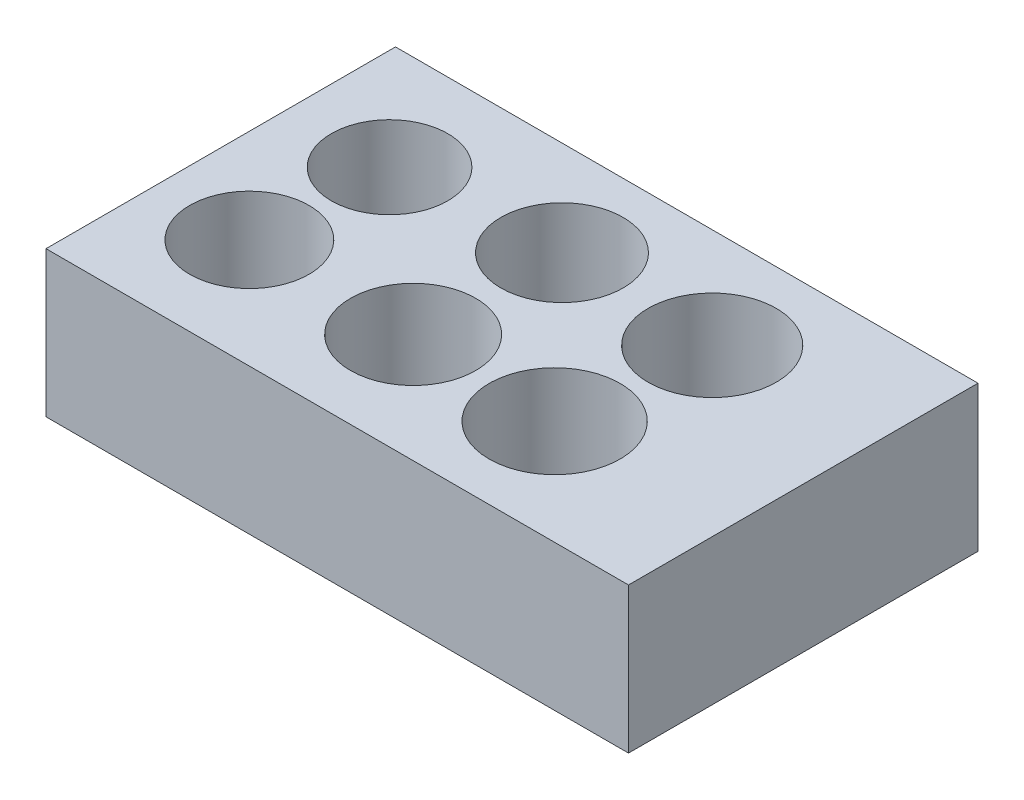
ISO-10303-21;
HEADER;
FILE_DESCRIPTION(('STEP AP214'),'2;1');
FILE_NAME('part.step','',(''),(''),'','','');
FILE_SCHEMA(('AUTOMOTIVE_DESIGN { 1 0 10303 214 1 1 1 1 }'));
ENDSEC;
DATA;
#1=APPLICATION_CONTEXT('core data for automotive mechanical design processes');
#2=APPLICATION_PROTOCOL_DEFINITION('international standard','automotive_design',2000,#1);
#3=PRODUCT_CONTEXT('',#1,'mechanical');
#4=PRODUCT('Part','Part','',(#3));
#5=PRODUCT_RELATED_PRODUCT_CATEGORY('part','',(#4));
#6=PRODUCT_DEFINITION_FORMATION('','',#4);
#7=PRODUCT_DEFINITION_CONTEXT('part definition',#1,'design');
#8=PRODUCT_DEFINITION('design','',#6,#7);
#9=PRODUCT_DEFINITION_SHAPE('','',#8);
#10=(LENGTH_UNIT() NAMED_UNIT(*) SI_UNIT(.MILLI.,.METRE.));
#11=(NAMED_UNIT(*) PLANE_ANGLE_UNIT() SI_UNIT($,.RADIAN.));
#12=(NAMED_UNIT(*) SI_UNIT($,.STERADIAN.) SOLID_ANGLE_UNIT());
#13=UNCERTAINTY_MEASURE_WITH_UNIT(LENGTH_MEASURE(1.E-05),#10,'distance_accuracy_value','');
#14=(GEOMETRIC_REPRESENTATION_CONTEXT(3) GLOBAL_UNCERTAINTY_ASSIGNED_CONTEXT((#13)) GLOBAL_UNIT_ASSIGNED_CONTEXT((#10,
#11,#12)) REPRESENTATION_CONTEXT('',''));
#15=CARTESIAN_POINT('',(0.,0.,0.));
#16=DIRECTION('',(0.,0.,1.));
#17=DIRECTION('',(1.,0.,0.));
#18=AXIS2_PLACEMENT_3D('',#15,#16,#17);
#19=CARTESIAN_POINT('',(0.,5.,0.));
#20=DIRECTION('',(1.,0.,0.));
#21=DIRECTION('',(0.,0.,-1.));
#22=AXIS2_PLACEMENT_3D('',#19,#20,#21);
#23=PLANE('',#22);
#24=DIRECTION('',(0.,0.,1.));
#25=VECTOR('',#24,1.);
#26=CARTESIAN_POINT('',(0.,0.,0.));
#27=LINE('',#26,#25);
#28=CARTESIAN_POINT('',(0.,0.,0.));
#29=VERTEX_POINT('',#28);
#30=CARTESIAN_POINT('',(0.,0.,12.));
#31=VERTEX_POINT('',#30);
#32=EDGE_CURVE('E98',#29,#31,#27,.T.);
#33=ORIENTED_EDGE('',*,*,#32,.T.);
#34=DIRECTION('',(0.,-1.,0.));
#35=VECTOR('',#34,1.);
#36=CARTESIAN_POINT('',(0.,5.,12.));
#37=LINE('',#36,#35);
#38=CARTESIAN_POINT('',(0.,5.,12.));
#39=VERTEX_POINT('',#38);
#40=EDGE_CURVE('E11',#39,#31,#37,.T.);
#41=ORIENTED_EDGE('',*,*,#40,.F.);
#42=DIRECTION('',(0.,0.,1.));
#43=VECTOR('',#42,1.);
#44=CARTESIAN_POINT('',(0.,5.,0.));
#45=LINE('',#44,#43);
#46=CARTESIAN_POINT('',(0.,5.,0.));
#47=VERTEX_POINT('',#46);
#48=EDGE_CURVE('E86',#47,#39,#45,.T.);
#49=ORIENTED_EDGE('',*,*,#48,.F.);
#50=DIRECTION('',(0.,-1.,0.));
#51=VECTOR('',#50,1.);
#52=CARTESIAN_POINT('',(0.,5.,0.));
#53=LINE('',#52,#51);
#54=EDGE_CURVE('E94',#47,#29,#53,.T.);
#55=ORIENTED_EDGE('',*,*,#54,.T.);
#56=EDGE_LOOP('',(#33,#41,#49,#55));
#57=FACE_BOUND('',#56,.T.);
#58=ADVANCED_FACE('F35',(#57),#23,.F.);
#59=CARTESIAN_POINT('',(0.,5.,12.));
#60=DIRECTION('',(0.,0.,-1.));
#61=DIRECTION('',(-1.,0.,0.));
#62=AXIS2_PLACEMENT_3D('',#59,#60,#61);
#63=PLANE('',#62);
#64=DIRECTION('',(1.,0.,0.));
#65=VECTOR('',#64,1.);
#66=CARTESIAN_POINT('',(0.,0.,12.));
#67=LINE('',#66,#65);
#68=CARTESIAN_POINT('',(20.,0.,12.));
#69=VERTEX_POINT('',#68);
#70=EDGE_CURVE('E90',#31,#69,#67,.T.);
#71=ORIENTED_EDGE('',*,*,#70,.T.);
#72=DIRECTION('',(0.,-1.,0.));
#73=VECTOR('',#72,1.);
#74=CARTESIAN_POINT('',(20.,5.,12.));
#75=LINE('',#74,#73);
#76=CARTESIAN_POINT('',(20.,5.,12.));
#77=VERTEX_POINT('',#76);
#78=EDGE_CURVE('E43',#77,#69,#75,.T.);
#79=ORIENTED_EDGE('',*,*,#78,.F.);
#80=DIRECTION('',(1.,0.,0.));
#81=VECTOR('',#80,1.);
#82=CARTESIAN_POINT('',(0.,5.,12.));
#83=LINE('',#82,#81);
#84=EDGE_CURVE('E81',#39,#77,#83,.T.);
#85=ORIENTED_EDGE('',*,*,#84,.F.);
#86=ORIENTED_EDGE('',*,*,#40,.T.);
#87=EDGE_LOOP('',(#71,#79,#85,#86));
#88=FACE_BOUND('',#87,.T.);
#89=ADVANCED_FACE('F89',(#88),#63,.F.);
#90=CARTESIAN_POINT('',(20.,5.,0.));
#91=DIRECTION('',(-1.,0.,0.));
#92=DIRECTION('',(0.,0.,1.));
#93=AXIS2_PLACEMENT_3D('',#90,#91,#92);
#94=PLANE('',#93);
#95=DIRECTION('',(0.,0.,-1.));
#96=VECTOR('',#95,1.);
#97=CARTESIAN_POINT('',(20.,0.,0.));
#98=LINE('',#97,#96);
#99=CARTESIAN_POINT('',(20.,0.,0.));
#100=VERTEX_POINT('',#99);
#101=EDGE_CURVE('E68',#69,#100,#98,.T.);
#102=ORIENTED_EDGE('',*,*,#101,.T.);
#103=DIRECTION('',(0.,-1.,0.));
#104=VECTOR('',#103,1.);
#105=CARTESIAN_POINT('',(20.,5.,0.));
#106=LINE('',#105,#104);
#107=CARTESIAN_POINT('',(20.,5.,0.));
#108=VERTEX_POINT('',#107);
#109=EDGE_CURVE('E91',#108,#100,#106,.T.);
#110=ORIENTED_EDGE('',*,*,#109,.F.);
#111=DIRECTION('',(0.,0.,-1.));
#112=VECTOR('',#111,1.);
#113=CARTESIAN_POINT('',(20.,5.,0.));
#114=LINE('',#113,#112);
#115=EDGE_CURVE('E84',#77,#108,#114,.T.);
#116=ORIENTED_EDGE('',*,*,#115,.F.);
#117=ORIENTED_EDGE('',*,*,#78,.T.);
#118=EDGE_LOOP('',(#102,#110,#116,#117));
#119=FACE_BOUND('',#118,.T.);
#120=ADVANCED_FACE('F92',(#119),#94,.F.);
#121=CARTESIAN_POINT('',(0.,5.,0.));
#122=DIRECTION('',(0.,0.,1.));
#123=DIRECTION('',(1.,0.,0.));
#124=AXIS2_PLACEMENT_3D('',#121,#122,#123);
#125=PLANE('',#124);
#126=DIRECTION('',(-1.,0.,0.));
#127=VECTOR('',#126,1.);
#128=CARTESIAN_POINT('',(0.,0.,0.));
#129=LINE('',#128,#127);
#130=EDGE_CURVE('E74',#100,#29,#129,.T.);
#131=ORIENTED_EDGE('',*,*,#130,.T.);
#132=ORIENTED_EDGE('',*,*,#54,.F.);
#133=DIRECTION('',(-1.,0.,0.));
#134=VECTOR('',#133,1.);
#135=CARTESIAN_POINT('',(0.,5.,0.));
#136=LINE('',#135,#134);
#137=EDGE_CURVE('E51',#108,#47,#136,.T.);
#138=ORIENTED_EDGE('',*,*,#137,.F.);
#139=ORIENTED_EDGE('',*,*,#109,.T.);
#140=EDGE_LOOP('',(#131,#132,#138,#139));
#141=FACE_BOUND('',#140,.T.);
#142=ADVANCED_FACE('F106',(#141),#125,.F.);
#143=CARTESIAN_POINT('',(0.,5.,0.));
#144=DIRECTION('',(0.,1.,0.));
#145=DIRECTION('',(0.,0.,1.));
#146=AXIS2_PLACEMENT_3D('',#143,#144,#145);
#147=PLANE('',#146);
#148=CARTESIAN_POINT('',(13.8636962839813,5.,8.39937742620122));
#149=DIRECTION('',(0.,1.,0.));
#150=DIRECTION('',(0.,0.,1.));
#151=AXIS2_PLACEMENT_3D('',#148,#149,#150);
#152=CIRCLE('',#151,2.24999999999999);
#153=CARTESIAN_POINT('',(13.8636962839813,5.,10.6493774262012));
#154=VERTEX_POINT('',#153);
#155=EDGE_CURVE('E130',#154,#154,#152,.T.);
#156=ORIENTED_EDGE('',*,*,#155,.F.);
#157=EDGE_LOOP('',(#156));
#158=FACE_BOUND('',#157,.T.);
#159=CARTESIAN_POINT('',(14.3103776014346,5.,3.43708627817207));
#160=DIRECTION('',(0.,1.,0.));
#161=DIRECTION('',(0.,0.,1.));
#162=AXIS2_PLACEMENT_3D('',#159,#160,#161);
#163=CIRCLE('',#162,2.2);
#164=CARTESIAN_POINT('',(14.3103776014346,5.,5.63708627817207));
#165=VERTEX_POINT('',#164);
#166=EDGE_CURVE('E136',#165,#165,#163,.T.);
#167=ORIENTED_EDGE('',*,*,#166,.F.);
#168=EDGE_LOOP('',(#167));
#169=FACE_BOUND('',#168,.T.);
#170=CARTESIAN_POINT('',(8.85263544746891,5.,8.24703579507257));
#171=DIRECTION('',(0.,1.,0.));
#172=DIRECTION('',(0.,0.,1.));
#173=AXIS2_PLACEMENT_3D('',#170,#171,#172);
#174=CIRCLE('',#173,2.15);
#175=CARTESIAN_POINT('',(8.85263544746891,5.,10.3970357950726));
#176=VERTEX_POINT('',#175);
#177=EDGE_CURVE('E142',#176,#176,#174,.T.);
#178=ORIENTED_EDGE('',*,*,#177,.F.);
#179=EDGE_LOOP('',(#178));
#180=FACE_BOUND('',#179,.T.);
#181=CARTESIAN_POINT('',(8.97813413310718,5.,3.26115742630861));
#182=DIRECTION('',(0.,1.,0.));
#183=DIRECTION('',(0.,0.,1.));
#184=AXIS2_PLACEMENT_3D('',#181,#182,#183);
#185=CIRCLE('',#184,2.1);
#186=CARTESIAN_POINT('',(8.97813413310718,5.,5.3611574263086));
#187=VERTEX_POINT('',#186);
#188=EDGE_CURVE('E118',#187,#187,#185,.T.);
#189=ORIENTED_EDGE('',*,*,#188,.F.);
#190=EDGE_LOOP('',(#189));
#191=FACE_BOUND('',#190,.T.);
#192=CARTESIAN_POINT('',(3.22959953446929,5.,8.24703579507257));
#193=DIRECTION('',(0.,1.,0.));
#194=DIRECTION('',(0.,0.,1.));
#195=AXIS2_PLACEMENT_3D('',#192,#193,#194);
#196=CIRCLE('',#195,2.05);
#197=CARTESIAN_POINT('',(3.22959953446929,5.,10.2970357950726));
#198=VERTEX_POINT('',#197);
#199=EDGE_CURVE('E125',#198,#198,#196,.T.);
#200=ORIENTED_EDGE('',*,*,#199,.F.);
#201=EDGE_LOOP('',(#200));
#202=FACE_BOUND('',#201,.T.);
#203=CARTESIAN_POINT('',(3.47625480848276,5.,3.68024210863282));
#204=DIRECTION('',(0.,1.,0.));
#205=DIRECTION('',(0.,0.,1.));
#206=AXIS2_PLACEMENT_3D('',#203,#204,#205);
#207=CIRCLE('',#206,2.);
#208=CARTESIAN_POINT('',(3.47625480848276,5.,5.68024210863282));
#209=VERTEX_POINT('',#208);
#210=EDGE_CURVE('E112',#209,#209,#207,.T.);
#211=ORIENTED_EDGE('',*,*,#210,.F.);
#212=EDGE_LOOP('',(#211));
#213=FACE_BOUND('',#212,.T.);
#214=ORIENTED_EDGE('',*,*,#48,.T.);
#215=ORIENTED_EDGE('',*,*,#84,.T.);
#216=ORIENTED_EDGE('',*,*,#115,.T.);
#217=ORIENTED_EDGE('',*,*,#137,.T.);
#218=EDGE_LOOP('',(#214,#215,#216,#217));
#219=FACE_BOUND('',#218,.T.);
#220=ADVANCED_FACE('F82',(#158,#169,#180,#191,#202,#213,#219),#147,.T.);
#221=CARTESIAN_POINT('',(0.,0.,0.));
#222=DIRECTION('',(0.,1.,0.));
#223=DIRECTION('',(0.,0.,1.));
#224=AXIS2_PLACEMENT_3D('',#221,#222,#223);
#225=PLANE('',#224);
#226=ORIENTED_EDGE('',*,*,#32,.F.);
#227=ORIENTED_EDGE('',*,*,#130,.F.);
#228=ORIENTED_EDGE('',*,*,#101,.F.);
#229=ORIENTED_EDGE('',*,*,#70,.F.);
#230=EDGE_LOOP('',(#226,#227,#228,#229));
#231=FACE_BOUND('',#230,.T.);
#232=ADVANCED_FACE('F109',(#231),#225,.F.);
#233=CARTESIAN_POINT('',(3.47625480848276,1.,3.68024210863282));
#234=DIRECTION('',(0.,1.,0.));
#235=DIRECTION('',(0.,0.,1.));
#236=AXIS2_PLACEMENT_3D('',#233,#234,#235);
#237=CYLINDRICAL_SURFACE('',#236,2.);
#238=CARTESIAN_POINT('',(3.47625480848276,1.,3.68024210863282));
#239=DIRECTION('',(0.,1.,0.));
#240=DIRECTION('',(0.,0.,1.));
#241=AXIS2_PLACEMENT_3D('',#238,#239,#240);
#242=CIRCLE('',#241,2.);
#243=CARTESIAN_POINT('',(3.47625480848276,1.,5.68024210863282));
#244=VERTEX_POINT('',#243);
#245=EDGE_CURVE('E101',#244,#244,#242,.T.);
#246=ORIENTED_EDGE('',*,*,#245,.F.);
#247=EDGE_LOOP('',(#246));
#248=FACE_BOUND('',#247,.T.);
#249=ORIENTED_EDGE('',*,*,#210,.T.);
#250=EDGE_LOOP('',(#249));
#251=FACE_BOUND('',#250,.T.);
#252=ADVANCED_FACE('F167',(#248,#251),#237,.F.);
#253=CARTESIAN_POINT('',(3.47625480848276,1.,3.68024210863282));
#254=DIRECTION('',(0.,1.,0.));
#255=DIRECTION('',(0.,0.,1.));
#256=AXIS2_PLACEMENT_3D('',#253,#254,#255);
#257=PLANE('',#256);
#258=ORIENTED_EDGE('',*,*,#245,.T.);
#259=EDGE_LOOP('',(#258));
#260=FACE_BOUND('',#259,.T.);
#261=ADVANCED_FACE('F169',(#260),#257,.T.);
#262=CARTESIAN_POINT('',(3.22959953446929,1.,8.24703579507257));
#263=DIRECTION('',(0.,1.,0.));
#264=DIRECTION('',(0.,0.,1.));
#265=AXIS2_PLACEMENT_3D('',#262,#263,#264);
#266=CYLINDRICAL_SURFACE('',#265,2.05);
#267=CARTESIAN_POINT('',(3.22959953446929,1.,8.24703579507257));
#268=DIRECTION('',(0.,1.,0.));
#269=DIRECTION('',(0.,0.,1.));
#270=AXIS2_PLACEMENT_3D('',#267,#268,#269);
#271=CIRCLE('',#270,2.05);
#272=CARTESIAN_POINT('',(3.22959953446929,1.,10.2970357950726));
#273=VERTEX_POINT('',#272);
#274=EDGE_CURVE('E115',#273,#273,#271,.T.);
#275=ORIENTED_EDGE('',*,*,#274,.F.);
#276=EDGE_LOOP('',(#275));
#277=FACE_BOUND('',#276,.T.);
#278=ORIENTED_EDGE('',*,*,#199,.T.);
#279=EDGE_LOOP('',(#278));
#280=FACE_BOUND('',#279,.T.);
#281=ADVANCED_FACE('F176',(#277,#280),#266,.F.);
#282=CARTESIAN_POINT('',(3.22959953446929,1.,8.24703579507257));
#283=DIRECTION('',(0.,1.,0.));
#284=DIRECTION('',(0.,0.,1.));
#285=AXIS2_PLACEMENT_3D('',#282,#283,#284);
#286=PLANE('',#285);
#287=ORIENTED_EDGE('',*,*,#274,.T.);
#288=EDGE_LOOP('',(#287));
#289=FACE_BOUND('',#288,.T.);
#290=ADVANCED_FACE('F224',(#289),#286,.T.);
#291=CARTESIAN_POINT('',(8.97813413310718,1.,3.26115742630861));
#292=DIRECTION('',(0.,1.,0.));
#293=DIRECTION('',(0.,0.,1.));
#294=AXIS2_PLACEMENT_3D('',#291,#292,#293);
#295=CYLINDRICAL_SURFACE('',#294,2.1);
#296=CARTESIAN_POINT('',(8.97813413310718,1.,3.26115742630861));
#297=DIRECTION('',(0.,1.,0.));
#298=DIRECTION('',(0.,0.,1.));
#299=AXIS2_PLACEMENT_3D('',#296,#297,#298);
#300=CIRCLE('',#299,2.1);
#301=CARTESIAN_POINT('',(8.97813413310718,1.,5.3611574263086));
#302=VERTEX_POINT('',#301);
#303=EDGE_CURVE('E121',#302,#302,#300,.T.);
#304=ORIENTED_EDGE('',*,*,#303,.F.);
#305=EDGE_LOOP('',(#304));
#306=FACE_BOUND('',#305,.T.);
#307=ORIENTED_EDGE('',*,*,#188,.T.);
#308=EDGE_LOOP('',(#307));
#309=FACE_BOUND('',#308,.T.);
#310=ADVANCED_FACE('F233',(#306,#309),#295,.F.);
#311=CARTESIAN_POINT('',(8.97813413310718,1.,3.26115742630861));
#312=DIRECTION('',(0.,1.,0.));
#313=DIRECTION('',(0.,0.,1.));
#314=AXIS2_PLACEMENT_3D('',#311,#312,#313);
#315=PLANE('',#314);
#316=ORIENTED_EDGE('',*,*,#303,.T.);
#317=EDGE_LOOP('',(#316));
#318=FACE_BOUND('',#317,.T.);
#319=ADVANCED_FACE('F153',(#318),#315,.T.);
#320=CARTESIAN_POINT('',(8.85263544746891,1.,8.24703579507257));
#321=DIRECTION('',(0.,1.,0.));
#322=DIRECTION('',(0.,0.,1.));
#323=AXIS2_PLACEMENT_3D('',#320,#321,#322);
#324=CYLINDRICAL_SURFACE('',#323,2.15);
#325=CARTESIAN_POINT('',(8.85263544746891,1.,8.24703579507257));
#326=DIRECTION('',(0.,1.,0.));
#327=DIRECTION('',(0.,0.,1.));
#328=AXIS2_PLACEMENT_3D('',#325,#326,#327);
#329=CIRCLE('',#328,2.15);
#330=CARTESIAN_POINT('',(8.85263544746891,1.,10.3970357950726));
#331=VERTEX_POINT('',#330);
#332=EDGE_CURVE('E122',#331,#331,#329,.T.);
#333=ORIENTED_EDGE('',*,*,#332,.F.);
#334=EDGE_LOOP('',(#333));
#335=FACE_BOUND('',#334,.T.);
#336=ORIENTED_EDGE('',*,*,#177,.T.);
#337=EDGE_LOOP('',(#336));
#338=FACE_BOUND('',#337,.T.);
#339=ADVANCED_FACE('F150',(#335,#338),#324,.F.);
#340=CARTESIAN_POINT('',(8.85263544746891,1.,8.24703579507257));
#341=DIRECTION('',(0.,1.,0.));
#342=DIRECTION('',(0.,0.,1.));
#343=AXIS2_PLACEMENT_3D('',#340,#341,#342);
#344=PLANE('',#343);
#345=ORIENTED_EDGE('',*,*,#332,.T.);
#346=EDGE_LOOP('',(#345));
#347=FACE_BOUND('',#346,.T.);
#348=ADVANCED_FACE('F148',(#347),#344,.T.);
#349=CARTESIAN_POINT('',(14.3103776014346,1.,3.43708627817207));
#350=DIRECTION('',(0.,1.,0.));
#351=DIRECTION('',(0.,0.,1.));
#352=AXIS2_PLACEMENT_3D('',#349,#350,#351);
#353=CYLINDRICAL_SURFACE('',#352,2.2);
#354=CARTESIAN_POINT('',(14.3103776014346,1.,3.43708627817207));
#355=DIRECTION('',(0.,1.,0.));
#356=DIRECTION('',(0.,0.,1.));
#357=AXIS2_PLACEMENT_3D('',#354,#355,#356);
#358=CIRCLE('',#357,2.2);
#359=CARTESIAN_POINT('',(14.3103776014346,1.,5.63708627817207));
#360=VERTEX_POINT('',#359);
#361=EDGE_CURVE('E139',#360,#360,#358,.T.);
#362=ORIENTED_EDGE('',*,*,#361,.F.);
#363=EDGE_LOOP('',(#362));
#364=FACE_BOUND('',#363,.T.);
#365=ORIENTED_EDGE('',*,*,#166,.T.);
#366=EDGE_LOOP('',(#365));
#367=FACE_BOUND('',#366,.T.);
#368=ADVANCED_FACE('F263',(#364,#367),#353,.F.);
#369=CARTESIAN_POINT('',(14.3103776014346,1.,3.43708627817207));
#370=DIRECTION('',(0.,1.,0.));
#371=DIRECTION('',(0.,0.,1.));
#372=AXIS2_PLACEMENT_3D('',#369,#370,#371);
#373=PLANE('',#372);
#374=ORIENTED_EDGE('',*,*,#361,.T.);
#375=EDGE_LOOP('',(#374));
#376=FACE_BOUND('',#375,.T.);
#377=ADVANCED_FACE('F271',(#376),#373,.T.);
#378=CARTESIAN_POINT('',(13.8636962839813,1.,8.39937742620122));
#379=DIRECTION('',(0.,1.,0.));
#380=DIRECTION('',(0.,0.,1.));
#381=AXIS2_PLACEMENT_3D('',#378,#379,#380);
#382=CYLINDRICAL_SURFACE('',#381,2.24999999999999);
#383=CARTESIAN_POINT('',(13.8636962839813,1.,8.39937742620122));
#384=DIRECTION('',(0.,1.,0.));
#385=DIRECTION('',(0.,0.,1.));
#386=AXIS2_PLACEMENT_3D('',#383,#384,#385);
#387=CIRCLE('',#386,2.24999999999999);
#388=CARTESIAN_POINT('',(13.8636962839813,1.,10.6493774262012));
#389=VERTEX_POINT('',#388);
#390=EDGE_CURVE('E133',#389,#389,#387,.T.);
#391=ORIENTED_EDGE('',*,*,#390,.F.);
#392=EDGE_LOOP('',(#391));
#393=FACE_BOUND('',#392,.T.);
#394=ORIENTED_EDGE('',*,*,#155,.T.);
#395=EDGE_LOOP('',(#394));
#396=FACE_BOUND('',#395,.T.);
#397=ADVANCED_FACE('F280',(#393,#396),#382,.F.);
#398=CARTESIAN_POINT('',(13.8636962839813,1.,8.39937742620122));
#399=DIRECTION('',(0.,1.,0.));
#400=DIRECTION('',(0.,0.,1.));
#401=AXIS2_PLACEMENT_3D('',#398,#399,#400);
#402=PLANE('',#401);
#403=ORIENTED_EDGE('',*,*,#390,.T.);
#404=EDGE_LOOP('',(#403));
#405=FACE_BOUND('',#404,.T.);
#406=ADVANCED_FACE('F289',(#405),#402,.T.);
#407=CLOSED_SHELL('',(#58,#89,#120,#142,#220,#232,#252,#261,#281,#290,#310,#319,#339,#348,#368,
#377,#397,#406));
#408=MANIFOLD_SOLID_BREP('B2',#407);
#409=ADVANCED_BREP_SHAPE_REPRESENTATION('',(#18,#408),#14);
#410=SHAPE_DEFINITION_REPRESENTATION(#9,#409);
ENDSEC;
END-ISO-10303-21;
